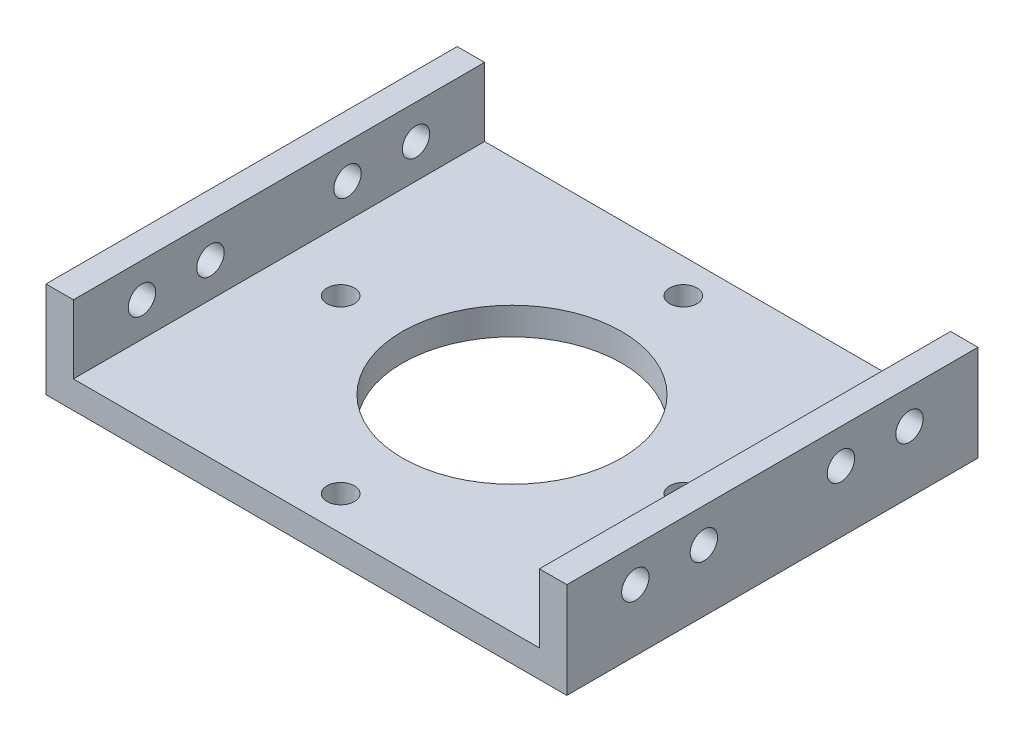
ISO-10303-21;
HEADER;
FILE_DESCRIPTION(('STEP AP214'),'2;1');
FILE_NAME('part.step','',(''),(''),'','','');
FILE_SCHEMA(('AUTOMOTIVE_DESIGN { 1 0 10303 214 1 1 1 1 }'));
ENDSEC;
DATA;
#1=APPLICATION_CONTEXT('core data for automotive mechanical design processes');
#2=APPLICATION_PROTOCOL_DEFINITION('international standard','automotive_design',2000,#1);
#3=PRODUCT_CONTEXT('',#1,'mechanical');
#4=PRODUCT('Part','Part','',(#3));
#5=PRODUCT_RELATED_PRODUCT_CATEGORY('part','',(#4));
#6=PRODUCT_DEFINITION_FORMATION('','',#4);
#7=PRODUCT_DEFINITION_CONTEXT('part definition',#1,'design');
#8=PRODUCT_DEFINITION('design','',#6,#7);
#9=PRODUCT_DEFINITION_SHAPE('','',#8);
#10=(LENGTH_UNIT() NAMED_UNIT(*) SI_UNIT(.MILLI.,.METRE.));
#11=(NAMED_UNIT(*) PLANE_ANGLE_UNIT() SI_UNIT($,.RADIAN.));
#12=(NAMED_UNIT(*) SI_UNIT($,.STERADIAN.) SOLID_ANGLE_UNIT());
#13=UNCERTAINTY_MEASURE_WITH_UNIT(LENGTH_MEASURE(1.E-05),#10,'distance_accuracy_value','');
#14=(GEOMETRIC_REPRESENTATION_CONTEXT(3) GLOBAL_UNCERTAINTY_ASSIGNED_CONTEXT((#13)) GLOBAL_UNIT_ASSIGNED_CONTEXT((#10,
#11,#12)) REPRESENTATION_CONTEXT('',''));
#15=CARTESIAN_POINT('',(0.,0.,0.));
#16=DIRECTION('',(0.,0.,1.));
#17=DIRECTION('',(1.,0.,0.));
#18=AXIS2_PLACEMENT_3D('',#15,#16,#17);
#19=CARTESIAN_POINT('',(38.,14.,30.));
#20=DIRECTION('',(0.,-1.,0.));
#21=DIRECTION('',(0.,0.,-1.));
#22=AXIS2_PLACEMENT_3D('',#19,#20,#21);
#23=PLANE('',#22);
#24=DIRECTION('',(-1.,0.,0.));
#25=VECTOR('',#24,1.);
#26=CARTESIAN_POINT('',(38.,14.,-30.));
#27=LINE('',#26,#25);
#28=CARTESIAN_POINT('',(38.,14.,-30.));
#29=VERTEX_POINT('',#28);
#30=CARTESIAN_POINT('',(34.,14.,-30.));
#31=VERTEX_POINT('',#30);
#32=EDGE_CURVE('E132',#29,#31,#27,.T.);
#33=ORIENTED_EDGE('',*,*,#32,.T.);
#34=DIRECTION('',(0.,0.,-1.));
#35=VECTOR('',#34,1.);
#36=CARTESIAN_POINT('',(34.,14.,30.));
#37=LINE('',#36,#35);
#38=CARTESIAN_POINT('',(34.,14.,30.));
#39=VERTEX_POINT('',#38);
#40=EDGE_CURVE('E11',#39,#31,#37,.T.);
#41=ORIENTED_EDGE('',*,*,#40,.F.);
#42=DIRECTION('',(-1.,0.,0.));
#43=VECTOR('',#42,1.);
#44=CARTESIAN_POINT('',(38.,14.,30.));
#45=LINE('',#44,#43);
#46=CARTESIAN_POINT('',(38.,14.,30.));
#47=VERTEX_POINT('',#46);
#48=EDGE_CURVE('E147',#47,#39,#45,.T.);
#49=ORIENTED_EDGE('',*,*,#48,.F.);
#50=DIRECTION('',(0.,0.,-1.));
#51=VECTOR('',#50,1.);
#52=CARTESIAN_POINT('',(38.,14.,30.));
#53=LINE('',#52,#51);
#54=EDGE_CURVE('E128',#47,#29,#53,.T.);
#55=ORIENTED_EDGE('',*,*,#54,.T.);
#56=EDGE_LOOP('',(#33,#41,#49,#55));
#57=FACE_BOUND('',#56,.T.);
#58=ADVANCED_FACE('F36',(#57),#23,.F.);
#59=CARTESIAN_POINT('',(34.,14.,30.));
#60=DIRECTION('',(1.,0.,0.));
#61=DIRECTION('',(0.,0.,-1.));
#62=AXIS2_PLACEMENT_3D('',#59,#60,#61);
#63=PLANE('',#62);
#64=CARTESIAN_POINT('',(34.,8.99999999999999,20.));
#65=DIRECTION('',(1.,0.,0.));
#66=DIRECTION('',(0.,0.,-1.));
#67=AXIS2_PLACEMENT_3D('',#64,#65,#66);
#68=CIRCLE('',#67,2.);
#69=CARTESIAN_POINT('',(34.,8.99999999999999,18.));
#70=VERTEX_POINT('',#69);
#71=EDGE_CURVE('E136',#70,#70,#68,.T.);
#72=ORIENTED_EDGE('',*,*,#71,.T.);
#73=EDGE_LOOP('',(#72));
#74=FACE_BOUND('',#73,.T.);
#75=CARTESIAN_POINT('',(34.,8.99999999999999,10.));
#76=DIRECTION('',(1.,0.,0.));
#77=DIRECTION('',(0.,0.,-1.));
#78=AXIS2_PLACEMENT_3D('',#75,#76,#77);
#79=CIRCLE('',#78,2.);
#80=CARTESIAN_POINT('',(34.,8.99999999999999,8.));
#81=VERTEX_POINT('',#80);
#82=EDGE_CURVE('E185',#81,#81,#79,.T.);
#83=ORIENTED_EDGE('',*,*,#82,.T.);
#84=EDGE_LOOP('',(#83));
#85=FACE_BOUND('',#84,.T.);
#86=CARTESIAN_POINT('',(34.,8.99999999999999,-10.));
#87=DIRECTION('',(1.,0.,0.));
#88=DIRECTION('',(0.,0.,-1.));
#89=AXIS2_PLACEMENT_3D('',#86,#87,#88);
#90=CIRCLE('',#89,2.);
#91=CARTESIAN_POINT('',(34.,8.99999999999999,-12.));
#92=VERTEX_POINT('',#91);
#93=EDGE_CURVE('E191',#92,#92,#90,.T.);
#94=ORIENTED_EDGE('',*,*,#93,.T.);
#95=EDGE_LOOP('',(#94));
#96=FACE_BOUND('',#95,.T.);
#97=CARTESIAN_POINT('',(34.,8.99999999999999,-20.));
#98=DIRECTION('',(1.,0.,0.));
#99=DIRECTION('',(0.,0.,-1.));
#100=AXIS2_PLACEMENT_3D('',#97,#98,#99);
#101=CIRCLE('',#100,2.);
#102=CARTESIAN_POINT('',(34.,8.99999999999999,-22.));
#103=VERTEX_POINT('',#102);
#104=EDGE_CURVE('E197',#103,#103,#101,.T.);
#105=ORIENTED_EDGE('',*,*,#104,.T.);
#106=EDGE_LOOP('',(#105));
#107=FACE_BOUND('',#106,.T.);
#108=DIRECTION('',(0.,-1.,0.));
#109=VECTOR('',#108,1.);
#110=CARTESIAN_POINT('',(34.,14.,-30.));
#111=LINE('',#110,#109);
#112=CARTESIAN_POINT('',(34.,3.99999999999999,-30.));
#113=VERTEX_POINT('',#112);
#114=EDGE_CURVE('E135',#31,#113,#111,.T.);
#115=ORIENTED_EDGE('',*,*,#114,.T.);
#116=DIRECTION('',(0.,0.,-1.));
#117=VECTOR('',#116,1.);
#118=CARTESIAN_POINT('',(34.,3.99999999999999,30.));
#119=LINE('',#118,#117);
#120=CARTESIAN_POINT('',(34.,3.99999999999999,30.));
#121=VERTEX_POINT('',#120);
#122=EDGE_CURVE('E44',#121,#113,#119,.T.);
#123=ORIENTED_EDGE('',*,*,#122,.F.);
#124=DIRECTION('',(0.,-1.,0.));
#125=VECTOR('',#124,1.);
#126=CARTESIAN_POINT('',(34.,14.,30.));
#127=LINE('',#126,#125);
#128=EDGE_CURVE('E95',#39,#121,#127,.T.);
#129=ORIENTED_EDGE('',*,*,#128,.F.);
#130=ORIENTED_EDGE('',*,*,#40,.T.);
#131=EDGE_LOOP('',(#115,#123,#129,#130));
#132=FACE_BOUND('',#131,.T.);
#133=ADVANCED_FACE('F262',(#74,#85,#96,#107,#132),#63,.F.);
#134=CARTESIAN_POINT('',(-34.,3.99999999999999,30.));
#135=DIRECTION('',(0.,-1.,0.));
#136=DIRECTION('',(0.,0.,-1.));
#137=AXIS2_PLACEMENT_3D('',#134,#135,#136);
#138=PLANE('',#137);
#139=CARTESIAN_POINT('',(0.,3.99999999999999,-25.));
#140=DIRECTION('',(0.,1.,0.));
#141=DIRECTION('',(0.,0.,1.));
#142=AXIS2_PLACEMENT_3D('',#139,#140,#141);
#143=CIRCLE('',#142,2.);
#144=CARTESIAN_POINT('',(0.,3.99999999999999,-23.));
#145=VERTEX_POINT('',#144);
#146=EDGE_CURVE('E237',#145,#145,#143,.T.);
#147=ORIENTED_EDGE('',*,*,#146,.F.);
#148=EDGE_LOOP('',(#147));
#149=FACE_BOUND('',#148,.T.);
#150=CARTESIAN_POINT('',(25.0000000000007,3.99999999999999,-7.05950310263298E-13));
#151=DIRECTION('',(0.,1.,0.));
#152=DIRECTION('',(0.,0.,1.));
#153=AXIS2_PLACEMENT_3D('',#150,#151,#152);
#154=CIRCLE('',#153,2.00000000000055);
#155=CARTESIAN_POINT('',(25.0000000000007,3.99999999999999,1.99999999999985));
#156=VERTEX_POINT('',#155);
#157=EDGE_CURVE('E238',#156,#156,#154,.T.);
#158=ORIENTED_EDGE('',*,*,#157,.F.);
#159=EDGE_LOOP('',(#158));
#160=FACE_BOUND('',#159,.T.);
#161=CARTESIAN_POINT('',(1.4119006205266E-12,3.99999999999999,25.));
#162=DIRECTION('',(0.,1.,0.));
#163=DIRECTION('',(0.,0.,1.));
#164=AXIS2_PLACEMENT_3D('',#161,#162,#163);
#165=CIRCLE('',#164,2.00000000000152);
#166=CARTESIAN_POINT('',(1.4119006205266E-12,3.99999999999999,27.0000000000015));
#167=VERTEX_POINT('',#166);
#168=EDGE_CURVE('E249',#167,#167,#165,.T.);
#169=ORIENTED_EDGE('',*,*,#168,.F.);
#170=EDGE_LOOP('',(#169));
#171=FACE_BOUND('',#170,.T.);
#172=CARTESIAN_POINT('',(-24.9999999999993,3.99999999999999,7.09011927261166E-13));
#173=DIRECTION('',(0.,1.,0.));
#174=DIRECTION('',(0.,0.,1.));
#175=AXIS2_PLACEMENT_3D('',#172,#173,#174);
#176=CIRCLE('',#175,2.00000000000113);
#177=CARTESIAN_POINT('',(-24.9999999999993,3.99999999999999,2.00000000000184));
#178=VERTEX_POINT('',#177);
#179=EDGE_CURVE('E250',#178,#178,#176,.T.);
#180=ORIENTED_EDGE('',*,*,#179,.F.);
#181=EDGE_LOOP('',(#180));
#182=FACE_BOUND('',#181,.T.);
#183=CARTESIAN_POINT('',(0.,3.99999999999999,0.));
#184=DIRECTION('',(0.,1.,0.));
#185=DIRECTION('',(0.,0.,1.));
#186=AXIS2_PLACEMENT_3D('',#183,#184,#185);
#187=CIRCLE('',#186,16.);
#188=CARTESIAN_POINT('',(0.,3.99999999999999,16.));
#189=VERTEX_POINT('',#188);
#190=EDGE_CURVE('E230',#189,#189,#187,.T.);
#191=ORIENTED_EDGE('',*,*,#190,.F.);
#192=EDGE_LOOP('',(#191));
#193=FACE_BOUND('',#192,.T.);
#194=DIRECTION('',(-1.,0.,0.));
#195=VECTOR('',#194,1.);
#196=CARTESIAN_POINT('',(-34.,3.99999999999999,-30.));
#197=LINE('',#196,#195);
#198=CARTESIAN_POINT('',(-34.,3.99999999999999,-30.));
#199=VERTEX_POINT('',#198);
#200=EDGE_CURVE('E138',#113,#199,#197,.T.);
#201=ORIENTED_EDGE('',*,*,#200,.T.);
#202=DIRECTION('',(0.,0.,-1.));
#203=VECTOR('',#202,1.);
#204=CARTESIAN_POINT('',(-34.,3.99999999999999,30.));
#205=LINE('',#204,#203);
#206=CARTESIAN_POINT('',(-34.,3.99999999999999,30.));
#207=VERTEX_POINT('',#206);
#208=EDGE_CURVE('E154',#207,#199,#205,.T.);
#209=ORIENTED_EDGE('',*,*,#208,.F.);
#210=DIRECTION('',(-1.,0.,0.));
#211=VECTOR('',#210,1.);
#212=CARTESIAN_POINT('',(-34.,3.99999999999999,30.));
#213=LINE('',#212,#211);
#214=EDGE_CURVE('E162',#121,#207,#213,.T.);
#215=ORIENTED_EDGE('',*,*,#214,.F.);
#216=ORIENTED_EDGE('',*,*,#122,.T.);
#217=EDGE_LOOP('',(#201,#209,#215,#216));
#218=FACE_BOUND('',#217,.T.);
#219=ADVANCED_FACE('F160',(#149,#160,#171,#182,#193,#218),#138,.F.);
#220=CARTESIAN_POINT('',(-34.,14.,30.));
#221=DIRECTION('',(-1.,0.,0.));
#222=DIRECTION('',(0.,0.,1.));
#223=AXIS2_PLACEMENT_3D('',#220,#221,#222);
#224=PLANE('',#223);
#225=CARTESIAN_POINT('',(-34.,8.99999999999999,20.));
#226=DIRECTION('',(-1.,0.,0.));
#227=DIRECTION('',(0.,0.,1.));
#228=AXIS2_PLACEMENT_3D('',#225,#226,#227);
#229=CIRCLE('',#228,2.);
#230=CARTESIAN_POINT('',(-34.,8.99999999999999,22.));
#231=VERTEX_POINT('',#230);
#232=EDGE_CURVE('E182',#231,#231,#229,.T.);
#233=ORIENTED_EDGE('',*,*,#232,.T.);
#234=EDGE_LOOP('',(#233));
#235=FACE_BOUND('',#234,.T.);
#236=CARTESIAN_POINT('',(-34.,8.99999999999999,10.));
#237=DIRECTION('',(-1.,0.,0.));
#238=DIRECTION('',(0.,0.,1.));
#239=AXIS2_PLACEMENT_3D('',#236,#237,#238);
#240=CIRCLE('',#239,2.);
#241=CARTESIAN_POINT('',(-34.,8.99999999999999,12.));
#242=VERTEX_POINT('',#241);
#243=EDGE_CURVE('E188',#242,#242,#240,.T.);
#244=ORIENTED_EDGE('',*,*,#243,.T.);
#245=EDGE_LOOP('',(#244));
#246=FACE_BOUND('',#245,.T.);
#247=CARTESIAN_POINT('',(-34.,8.99999999999999,-10.));
#248=DIRECTION('',(-1.,0.,0.));
#249=DIRECTION('',(0.,0.,1.));
#250=AXIS2_PLACEMENT_3D('',#247,#248,#249);
#251=CIRCLE('',#250,2.);
#252=CARTESIAN_POINT('',(-34.,8.99999999999999,-8.));
#253=VERTEX_POINT('',#252);
#254=EDGE_CURVE('E194',#253,#253,#251,.T.);
#255=ORIENTED_EDGE('',*,*,#254,.T.);
#256=EDGE_LOOP('',(#255));
#257=FACE_BOUND('',#256,.T.);
#258=CARTESIAN_POINT('',(-34.,8.99999999999999,-20.));
#259=DIRECTION('',(-1.,0.,0.));
#260=DIRECTION('',(0.,0.,1.));
#261=AXIS2_PLACEMENT_3D('',#258,#259,#260);
#262=CIRCLE('',#261,2.);
#263=CARTESIAN_POINT('',(-34.,8.99999999999999,-18.));
#264=VERTEX_POINT('',#263);
#265=EDGE_CURVE('E200',#264,#264,#262,.T.);
#266=ORIENTED_EDGE('',*,*,#265,.T.);
#267=EDGE_LOOP('',(#266));
#268=FACE_BOUND('',#267,.T.);
#269=DIRECTION('',(0.,1.,0.));
#270=VECTOR('',#269,1.);
#271=CARTESIAN_POINT('',(-34.,14.,-30.));
#272=LINE('',#271,#270);
#273=CARTESIAN_POINT('',(-34.,14.,-30.));
#274=VERTEX_POINT('',#273);
#275=EDGE_CURVE('E140',#199,#274,#272,.T.);
#276=ORIENTED_EDGE('',*,*,#275,.T.);
#277=DIRECTION('',(0.,0.,-1.));
#278=VECTOR('',#277,1.);
#279=CARTESIAN_POINT('',(-34.,14.,30.));
#280=LINE('',#279,#278);
#281=CARTESIAN_POINT('',(-34.,14.,30.));
#282=VERTEX_POINT('',#281);
#283=EDGE_CURVE('E151',#282,#274,#280,.T.);
#284=ORIENTED_EDGE('',*,*,#283,.F.);
#285=DIRECTION('',(0.,1.,0.));
#286=VECTOR('',#285,1.);
#287=CARTESIAN_POINT('',(-34.,14.,30.));
#288=LINE('',#287,#286);
#289=EDGE_CURVE('E174',#207,#282,#288,.T.);
#290=ORIENTED_EDGE('',*,*,#289,.F.);
#291=ORIENTED_EDGE('',*,*,#208,.T.);
#292=EDGE_LOOP('',(#276,#284,#290,#291));
#293=FACE_BOUND('',#292,.T.);
#294=ADVANCED_FACE('F170',(#235,#246,#257,#268,#293),#224,.F.);
#295=CARTESIAN_POINT('',(-38.,14.,30.));
#296=DIRECTION('',(0.,-1.,0.));
#297=DIRECTION('',(0.,0.,-1.));
#298=AXIS2_PLACEMENT_3D('',#295,#296,#297);
#299=PLANE('',#298);
#300=DIRECTION('',(-1.,0.,0.));
#301=VECTOR('',#300,1.);
#302=CARTESIAN_POINT('',(-38.,14.,-30.));
#303=LINE('',#302,#301);
#304=CARTESIAN_POINT('',(-38.,14.,-30.));
#305=VERTEX_POINT('',#304);
#306=EDGE_CURVE('E142',#274,#305,#303,.T.);
#307=ORIENTED_EDGE('',*,*,#306,.T.);
#308=DIRECTION('',(0.,0.,-1.));
#309=VECTOR('',#308,1.);
#310=CARTESIAN_POINT('',(-38.,14.,30.));
#311=LINE('',#310,#309);
#312=CARTESIAN_POINT('',(-38.,14.,30.));
#313=VERTEX_POINT('',#312);
#314=EDGE_CURVE('E123',#313,#305,#311,.T.);
#315=ORIENTED_EDGE('',*,*,#314,.F.);
#316=DIRECTION('',(-1.,0.,0.));
#317=VECTOR('',#316,1.);
#318=CARTESIAN_POINT('',(-38.,14.,30.));
#319=LINE('',#318,#317);
#320=EDGE_CURVE('E114',#282,#313,#319,.T.);
#321=ORIENTED_EDGE('',*,*,#320,.F.);
#322=ORIENTED_EDGE('',*,*,#283,.T.);
#323=EDGE_LOOP('',(#307,#315,#321,#322));
#324=FACE_BOUND('',#323,.T.);
#325=ADVANCED_FACE('F173',(#324),#299,.F.);
#326=CARTESIAN_POINT('',(-38.,0.,30.));
#327=DIRECTION('',(1.,0.,0.));
#328=DIRECTION('',(0.,0.,-1.));
#329=AXIS2_PLACEMENT_3D('',#326,#327,#328);
#330=PLANE('',#329);
#331=CARTESIAN_POINT('',(-38.,8.99999999999999,20.));
#332=DIRECTION('',(1.,0.,0.));
#333=DIRECTION('',(0.,0.,-1.));
#334=AXIS2_PLACEMENT_3D('',#331,#332,#333);
#335=CIRCLE('',#334,2.);
#336=CARTESIAN_POINT('',(-38.,8.99999999999999,18.));
#337=VERTEX_POINT('',#336);
#338=EDGE_CURVE('E203',#337,#337,#335,.F.);
#339=ORIENTED_EDGE('',*,*,#338,.F.);
#340=EDGE_LOOP('',(#339));
#341=FACE_BOUND('',#340,.T.);
#342=CARTESIAN_POINT('',(-38.,8.99999999999999,10.));
#343=DIRECTION('',(1.,0.,0.));
#344=DIRECTION('',(0.,0.,-1.));
#345=AXIS2_PLACEMENT_3D('',#342,#343,#344);
#346=CIRCLE('',#345,2.);
#347=CARTESIAN_POINT('',(-38.,8.99999999999999,8.));
#348=VERTEX_POINT('',#347);
#349=EDGE_CURVE('E218',#348,#348,#346,.F.);
#350=ORIENTED_EDGE('',*,*,#349,.F.);
#351=EDGE_LOOP('',(#350));
#352=FACE_BOUND('',#351,.T.);
#353=CARTESIAN_POINT('',(-38.,8.99999999999999,-10.));
#354=DIRECTION('',(1.,0.,0.));
#355=DIRECTION('',(0.,0.,-1.));
#356=AXIS2_PLACEMENT_3D('',#353,#354,#355);
#357=CIRCLE('',#356,2.);
#358=CARTESIAN_POINT('',(-38.,8.99999999999999,-12.));
#359=VERTEX_POINT('',#358);
#360=EDGE_CURVE('E212',#359,#359,#357,.F.);
#361=ORIENTED_EDGE('',*,*,#360,.F.);
#362=EDGE_LOOP('',(#361));
#363=FACE_BOUND('',#362,.T.);
#364=CARTESIAN_POINT('',(-38.,8.99999999999999,-20.));
#365=DIRECTION('',(1.,0.,0.));
#366=DIRECTION('',(0.,0.,-1.));
#367=AXIS2_PLACEMENT_3D('',#364,#365,#366);
#368=CIRCLE('',#367,2.);
#369=CARTESIAN_POINT('',(-38.,8.99999999999999,-22.));
#370=VERTEX_POINT('',#369);
#371=EDGE_CURVE('E204',#370,#370,#368,.F.);
#372=ORIENTED_EDGE('',*,*,#371,.F.);
#373=EDGE_LOOP('',(#372));
#374=FACE_BOUND('',#373,.T.);
#375=DIRECTION('',(0.,-1.,0.));
#376=VECTOR('',#375,1.);
#377=CARTESIAN_POINT('',(-38.,0.,-30.));
#378=LINE('',#377,#376);
#379=CARTESIAN_POINT('',(-38.,0.,-30.));
#380=VERTEX_POINT('',#379);
#381=EDGE_CURVE('E122',#305,#380,#378,.T.);
#382=ORIENTED_EDGE('',*,*,#381,.T.);
#383=DIRECTION('',(0.,0.,-1.));
#384=VECTOR('',#383,1.);
#385=CARTESIAN_POINT('',(-38.,0.,30.));
#386=LINE('',#385,#384);
#387=CARTESIAN_POINT('',(-38.,0.,30.));
#388=VERTEX_POINT('',#387);
#389=EDGE_CURVE('E119',#388,#380,#386,.T.);
#390=ORIENTED_EDGE('',*,*,#389,.F.);
#391=DIRECTION('',(0.,-1.,0.));
#392=VECTOR('',#391,1.);
#393=CARTESIAN_POINT('',(-38.,0.,30.));
#394=LINE('',#393,#392);
#395=EDGE_CURVE('E108',#313,#388,#394,.T.);
#396=ORIENTED_EDGE('',*,*,#395,.F.);
#397=ORIENTED_EDGE('',*,*,#314,.T.);
#398=EDGE_LOOP('',(#382,#390,#396,#397));
#399=FACE_BOUND('',#398,.T.);
#400=ADVANCED_FACE('F120',(#341,#352,#363,#374,#399),#330,.F.);
#401=CARTESIAN_POINT('',(38.,0.,30.));
#402=DIRECTION('',(0.,1.,0.));
#403=DIRECTION('',(0.,0.,1.));
#404=AXIS2_PLACEMENT_3D('',#401,#402,#403);
#405=PLANE('',#404);
#406=CARTESIAN_POINT('',(0.,0.,-25.));
#407=DIRECTION('',(0.,1.,0.));
#408=DIRECTION('',(0.,0.,1.));
#409=AXIS2_PLACEMENT_3D('',#406,#407,#408);
#410=CIRCLE('',#409,2.);
#411=CARTESIAN_POINT('',(0.,0.,-23.));
#412=VERTEX_POINT('',#411);
#413=EDGE_CURVE('E233',#412,#412,#410,.F.);
#414=ORIENTED_EDGE('',*,*,#413,.F.);
#415=EDGE_LOOP('',(#414));
#416=FACE_BOUND('',#415,.T.);
#417=CARTESIAN_POINT('',(25.0000000000007,0.,-7.05950310263298E-13));
#418=DIRECTION('',(0.,1.,0.));
#419=DIRECTION('',(0.,0.,1.));
#420=AXIS2_PLACEMENT_3D('',#417,#418,#419);
#421=CIRCLE('',#420,2.00000000000055);
#422=CARTESIAN_POINT('',(25.0000000000007,0.,1.99999999999985));
#423=VERTEX_POINT('',#422);
#424=EDGE_CURVE('E234',#423,#423,#421,.F.);
#425=ORIENTED_EDGE('',*,*,#424,.F.);
#426=EDGE_LOOP('',(#425));
#427=FACE_BOUND('',#426,.T.);
#428=CARTESIAN_POINT('',(1.4119006205266E-12,0.,25.));
#429=DIRECTION('',(0.,1.,0.));
#430=DIRECTION('',(0.,0.,1.));
#431=AXIS2_PLACEMENT_3D('',#428,#429,#430);
#432=CIRCLE('',#431,2.00000000000152);
#433=CARTESIAN_POINT('',(1.4119006205266E-12,0.,27.0000000000015));
#434=VERTEX_POINT('',#433);
#435=EDGE_CURVE('E241',#434,#434,#432,.F.);
#436=ORIENTED_EDGE('',*,*,#435,.F.);
#437=EDGE_LOOP('',(#436));
#438=FACE_BOUND('',#437,.T.);
#439=CARTESIAN_POINT('',(-24.9999999999993,0.,7.09011927261166E-13));
#440=DIRECTION('',(0.,1.,0.));
#441=DIRECTION('',(0.,0.,1.));
#442=AXIS2_PLACEMENT_3D('',#439,#440,#441);
#443=CIRCLE('',#442,2.00000000000113);
#444=CARTESIAN_POINT('',(-24.9999999999993,0.,2.00000000000184));
#445=VERTEX_POINT('',#444);
#446=EDGE_CURVE('E246',#445,#445,#443,.F.);
#447=ORIENTED_EDGE('',*,*,#446,.F.);
#448=EDGE_LOOP('',(#447));
#449=FACE_BOUND('',#448,.T.);
#450=CARTESIAN_POINT('',(0.,0.,0.));
#451=DIRECTION('',(0.,1.,0.));
#452=DIRECTION('',(0.,0.,1.));
#453=AXIS2_PLACEMENT_3D('',#450,#451,#452);
#454=CIRCLE('',#453,16.);
#455=CARTESIAN_POINT('',(0.,0.,16.));
#456=VERTEX_POINT('',#455);
#457=EDGE_CURVE('E211',#456,#456,#454,.F.);
#458=ORIENTED_EDGE('',*,*,#457,.F.);
#459=EDGE_LOOP('',(#458));
#460=FACE_BOUND('',#459,.T.);
#461=DIRECTION('',(1.,0.,0.));
#462=VECTOR('',#461,1.);
#463=CARTESIAN_POINT('',(38.,0.,-30.));
#464=LINE('',#463,#462);
#465=CARTESIAN_POINT('',(38.,0.,-30.));
#466=VERTEX_POINT('',#465);
#467=EDGE_CURVE('E81',#380,#466,#464,.T.);
#468=ORIENTED_EDGE('',*,*,#467,.T.);
#469=DIRECTION('',(0.,0.,-1.));
#470=VECTOR('',#469,1.);
#471=CARTESIAN_POINT('',(38.,0.,30.));
#472=LINE('',#471,#470);
#473=CARTESIAN_POINT('',(38.,0.,30.));
#474=VERTEX_POINT('',#473);
#475=EDGE_CURVE('E124',#474,#466,#472,.T.);
#476=ORIENTED_EDGE('',*,*,#475,.F.);
#477=DIRECTION('',(1.,0.,0.));
#478=VECTOR('',#477,1.);
#479=CARTESIAN_POINT('',(38.,0.,30.));
#480=LINE('',#479,#478);
#481=EDGE_CURVE('E112',#388,#474,#480,.T.);
#482=ORIENTED_EDGE('',*,*,#481,.F.);
#483=ORIENTED_EDGE('',*,*,#389,.T.);
#484=EDGE_LOOP('',(#468,#476,#482,#483));
#485=FACE_BOUND('',#484,.T.);
#486=ADVANCED_FACE('F126',(#416,#427,#438,#449,#460,#485),#405,.F.);
#487=CARTESIAN_POINT('',(38.,0.,30.));
#488=DIRECTION('',(-1.,0.,0.));
#489=DIRECTION('',(0.,0.,1.));
#490=AXIS2_PLACEMENT_3D('',#487,#488,#489);
#491=PLANE('',#490);
#492=CARTESIAN_POINT('',(38.,8.99999999999999,20.));
#493=DIRECTION('',(1.,0.,0.));
#494=DIRECTION('',(0.,0.,-1.));
#495=AXIS2_PLACEMENT_3D('',#492,#493,#494);
#496=CIRCLE('',#495,2.);
#497=CARTESIAN_POINT('',(38.,8.99999999999999,18.));
#498=VERTEX_POINT('',#497);
#499=EDGE_CURVE('E221',#498,#498,#496,.T.);
#500=ORIENTED_EDGE('',*,*,#499,.F.);
#501=EDGE_LOOP('',(#500));
#502=FACE_BOUND('',#501,.T.);
#503=CARTESIAN_POINT('',(38.,8.99999999999999,10.));
#504=DIRECTION('',(1.,0.,0.));
#505=DIRECTION('',(0.,0.,-1.));
#506=AXIS2_PLACEMENT_3D('',#503,#504,#505);
#507=CIRCLE('',#506,2.);
#508=CARTESIAN_POINT('',(38.,8.99999999999999,8.));
#509=VERTEX_POINT('',#508);
#510=EDGE_CURVE('E215',#509,#509,#507,.T.);
#511=ORIENTED_EDGE('',*,*,#510,.F.);
#512=EDGE_LOOP('',(#511));
#513=FACE_BOUND('',#512,.T.);
#514=CARTESIAN_POINT('',(38.,8.99999999999999,-10.));
#515=DIRECTION('',(1.,0.,0.));
#516=DIRECTION('',(0.,0.,1.));
#517=AXIS2_PLACEMENT_3D('',#514,#515,#516);
#518=CIRCLE('',#517,2.);
#519=CARTESIAN_POINT('',(38.,8.99999999999999,-8.));
#520=VERTEX_POINT('',#519);
#521=EDGE_CURVE('E207',#520,#520,#518,.T.);
#522=ORIENTED_EDGE('',*,*,#521,.F.);
#523=EDGE_LOOP('',(#522));
#524=FACE_BOUND('',#523,.T.);
#525=CARTESIAN_POINT('',(38.,8.99999999999999,-20.));
#526=DIRECTION('',(1.,0.,0.));
#527=DIRECTION('',(0.,0.,1.));
#528=AXIS2_PLACEMENT_3D('',#525,#526,#527);
#529=CIRCLE('',#528,2.);
#530=CARTESIAN_POINT('',(38.,8.99999999999999,-18.));
#531=VERTEX_POINT('',#530);
#532=EDGE_CURVE('E208',#531,#531,#529,.T.);
#533=ORIENTED_EDGE('',*,*,#532,.F.);
#534=EDGE_LOOP('',(#533));
#535=FACE_BOUND('',#534,.T.);
#536=DIRECTION('',(0.,1.,0.));
#537=VECTOR('',#536,1.);
#538=CARTESIAN_POINT('',(38.,0.,-30.));
#539=LINE('',#538,#537);
#540=EDGE_CURVE('E87',#466,#29,#539,.T.);
#541=ORIENTED_EDGE('',*,*,#540,.T.);
#542=ORIENTED_EDGE('',*,*,#54,.F.);
#543=DIRECTION('',(0.,1.,0.));
#544=VECTOR('',#543,1.);
#545=CARTESIAN_POINT('',(38.,0.,30.));
#546=LINE('',#545,#544);
#547=EDGE_CURVE('E52',#474,#47,#546,.T.);
#548=ORIENTED_EDGE('',*,*,#547,.F.);
#549=ORIENTED_EDGE('',*,*,#475,.T.);
#550=EDGE_LOOP('',(#541,#542,#548,#549));
#551=FACE_BOUND('',#550,.T.);
#552=ADVANCED_FACE('F294',(#502,#513,#524,#535,#551),#491,.F.);
#553=CARTESIAN_POINT('',(0.,0.,30.));
#554=DIRECTION('',(0.,0.,1.));
#555=DIRECTION('',(1.,0.,0.));
#556=AXIS2_PLACEMENT_3D('',#553,#554,#555);
#557=PLANE('',#556);
#558=ORIENTED_EDGE('',*,*,#48,.T.);
#559=ORIENTED_EDGE('',*,*,#128,.T.);
#560=ORIENTED_EDGE('',*,*,#214,.T.);
#561=ORIENTED_EDGE('',*,*,#289,.T.);
#562=ORIENTED_EDGE('',*,*,#320,.T.);
#563=ORIENTED_EDGE('',*,*,#395,.T.);
#564=ORIENTED_EDGE('',*,*,#481,.T.);
#565=ORIENTED_EDGE('',*,*,#547,.T.);
#566=EDGE_LOOP('',(#558,#559,#560,#561,#562,#563,#564,#565));
#567=FACE_BOUND('',#566,.T.);
#568=ADVANCED_FACE('F110',(#567),#557,.T.);
#569=CARTESIAN_POINT('',(0.,0.,-30.));
#570=DIRECTION('',(0.,0.,1.));
#571=DIRECTION('',(1.,0.,0.));
#572=AXIS2_PLACEMENT_3D('',#569,#570,#571);
#573=PLANE('',#572);
#574=ORIENTED_EDGE('',*,*,#32,.F.);
#575=ORIENTED_EDGE('',*,*,#540,.F.);
#576=ORIENTED_EDGE('',*,*,#467,.F.);
#577=ORIENTED_EDGE('',*,*,#381,.F.);
#578=ORIENTED_EDGE('',*,*,#306,.F.);
#579=ORIENTED_EDGE('',*,*,#275,.F.);
#580=ORIENTED_EDGE('',*,*,#200,.F.);
#581=ORIENTED_EDGE('',*,*,#114,.F.);
#582=EDGE_LOOP('',(#574,#575,#576,#577,#578,#579,#580,#581));
#583=FACE_BOUND('',#582,.T.);
#584=ADVANCED_FACE('F166',(#583),#573,.F.);
#585=CARTESIAN_POINT('',(-43.6568542494924,8.99999999999999,-20.));
#586=DIRECTION('',(1.,0.,0.));
#587=DIRECTION('',(0.,0.,-1.));
#588=AXIS2_PLACEMENT_3D('',#585,#586,#587);
#589=CYLINDRICAL_SURFACE('',#588,2.);
#590=ORIENTED_EDGE('',*,*,#532,.T.);
#591=EDGE_LOOP('',(#590));
#592=FACE_BOUND('',#591,.T.);
#593=ORIENTED_EDGE('',*,*,#104,.F.);
#594=EDGE_LOOP('',(#593));
#595=FACE_BOUND('',#594,.T.);
#596=ADVANCED_FACE('F331',(#592,#595),#589,.F.);
#597=CARTESIAN_POINT('',(-43.6568542494924,8.99999999999999,-10.));
#598=DIRECTION('',(1.,0.,0.));
#599=DIRECTION('',(0.,0.,-1.));
#600=AXIS2_PLACEMENT_3D('',#597,#598,#599);
#601=CYLINDRICAL_SURFACE('',#600,2.);
#602=ORIENTED_EDGE('',*,*,#521,.T.);
#603=EDGE_LOOP('',(#602));
#604=FACE_BOUND('',#603,.T.);
#605=ORIENTED_EDGE('',*,*,#93,.F.);
#606=EDGE_LOOP('',(#605));
#607=FACE_BOUND('',#606,.T.);
#608=ADVANCED_FACE('F338',(#604,#607),#601,.F.);
#609=CARTESIAN_POINT('',(-43.6568542494924,8.99999999999999,10.));
#610=DIRECTION('',(1.,0.,0.));
#611=DIRECTION('',(0.,0.,-1.));
#612=AXIS2_PLACEMENT_3D('',#609,#610,#611);
#613=CYLINDRICAL_SURFACE('',#612,2.);
#614=ORIENTED_EDGE('',*,*,#510,.T.);
#615=EDGE_LOOP('',(#614));
#616=FACE_BOUND('',#615,.T.);
#617=ORIENTED_EDGE('',*,*,#82,.F.);
#618=EDGE_LOOP('',(#617));
#619=FACE_BOUND('',#618,.T.);
#620=ADVANCED_FACE('F339',(#616,#619),#613,.F.);
#621=CARTESIAN_POINT('',(-43.6568542494924,8.99999999999999,20.));
#622=DIRECTION('',(1.,0.,0.));
#623=DIRECTION('',(0.,0.,-1.));
#624=AXIS2_PLACEMENT_3D('',#621,#622,#623);
#625=CYLINDRICAL_SURFACE('',#624,2.);
#626=ORIENTED_EDGE('',*,*,#499,.T.);
#627=EDGE_LOOP('',(#626));
#628=FACE_BOUND('',#627,.T.);
#629=ORIENTED_EDGE('',*,*,#71,.F.);
#630=EDGE_LOOP('',(#629));
#631=FACE_BOUND('',#630,.T.);
#632=ADVANCED_FACE('F284',(#628,#631),#625,.F.);
#633=ORIENTED_EDGE('',*,*,#371,.T.);
#634=EDGE_LOOP('',(#633));
#635=FACE_BOUND('',#634,.T.);
#636=ORIENTED_EDGE('',*,*,#265,.F.);
#637=EDGE_LOOP('',(#636));
#638=FACE_BOUND('',#637,.T.);
#639=ADVANCED_FACE('F326',(#635,#638),#589,.F.);
#640=ORIENTED_EDGE('',*,*,#360,.T.);
#641=EDGE_LOOP('',(#640));
#642=FACE_BOUND('',#641,.T.);
#643=ORIENTED_EDGE('',*,*,#254,.F.);
#644=EDGE_LOOP('',(#643));
#645=FACE_BOUND('',#644,.T.);
#646=ADVANCED_FACE('F328',(#642,#645),#601,.F.);
#647=ORIENTED_EDGE('',*,*,#349,.T.);
#648=EDGE_LOOP('',(#647));
#649=FACE_BOUND('',#648,.T.);
#650=ORIENTED_EDGE('',*,*,#243,.F.);
#651=EDGE_LOOP('',(#650));
#652=FACE_BOUND('',#651,.T.);
#653=ADVANCED_FACE('F281',(#649,#652),#613,.F.);
#654=ORIENTED_EDGE('',*,*,#338,.T.);
#655=EDGE_LOOP('',(#654));
#656=FACE_BOUND('',#655,.T.);
#657=ORIENTED_EDGE('',*,*,#232,.F.);
#658=EDGE_LOOP('',(#657));
#659=FACE_BOUND('',#658,.T.);
#660=ADVANCED_FACE('F272',(#656,#659),#625,.F.);
#661=CARTESIAN_POINT('',(0.,-45.254833995939,0.));
#662=DIRECTION('',(0.,1.,0.));
#663=DIRECTION('',(0.,0.,1.));
#664=AXIS2_PLACEMENT_3D('',#661,#662,#663);
#665=CYLINDRICAL_SURFACE('',#664,16.);
#666=ORIENTED_EDGE('',*,*,#457,.T.);
#667=EDGE_LOOP('',(#666));
#668=FACE_BOUND('',#667,.T.);
#669=ORIENTED_EDGE('',*,*,#190,.T.);
#670=EDGE_LOOP('',(#669));
#671=FACE_BOUND('',#670,.T.);
#672=ADVANCED_FACE('F269',(#668,#671),#665,.F.);
#673=CARTESIAN_POINT('',(-24.9999999999993,-45.254833995939,7.09011927261166E-13));
#674=DIRECTION('',(0.,1.,0.));
#675=DIRECTION('',(0.,0.,1.));
#676=AXIS2_PLACEMENT_3D('',#673,#674,#675);
#677=CYLINDRICAL_SURFACE('',#676,2.00000000000113);
#678=ORIENTED_EDGE('',*,*,#446,.T.);
#679=EDGE_LOOP('',(#678));
#680=FACE_BOUND('',#679,.T.);
#681=ORIENTED_EDGE('',*,*,#179,.T.);
#682=EDGE_LOOP('',(#681));
#683=FACE_BOUND('',#682,.T.);
#684=ADVANCED_FACE('F271',(#680,#683),#677,.F.);
#685=CARTESIAN_POINT('',(1.4119006205266E-12,-45.254833995939,25.));
#686=DIRECTION('',(0.,1.,0.));
#687=DIRECTION('',(0.,0.,1.));
#688=AXIS2_PLACEMENT_3D('',#685,#686,#687);
#689=CYLINDRICAL_SURFACE('',#688,2.00000000000152);
#690=ORIENTED_EDGE('',*,*,#435,.T.);
#691=EDGE_LOOP('',(#690));
#692=FACE_BOUND('',#691,.T.);
#693=ORIENTED_EDGE('',*,*,#168,.T.);
#694=EDGE_LOOP('',(#693));
#695=FACE_BOUND('',#694,.T.);
#696=ADVANCED_FACE('F258',(#692,#695),#689,.F.);
#697=CARTESIAN_POINT('',(25.0000000000007,-45.254833995939,-7.05950310263298E-13));
#698=DIRECTION('',(0.,1.,0.));
#699=DIRECTION('',(0.,0.,1.));
#700=AXIS2_PLACEMENT_3D('',#697,#698,#699);
#701=CYLINDRICAL_SURFACE('',#700,2.00000000000055);
#702=ORIENTED_EDGE('',*,*,#424,.T.);
#703=EDGE_LOOP('',(#702));
#704=FACE_BOUND('',#703,.T.);
#705=ORIENTED_EDGE('',*,*,#157,.T.);
#706=EDGE_LOOP('',(#705));
#707=FACE_BOUND('',#706,.T.);
#708=ADVANCED_FACE('F463',(#704,#707),#701,.F.);
#709=CARTESIAN_POINT('',(0.,-45.254833995939,-25.));
#710=DIRECTION('',(0.,1.,0.));
#711=DIRECTION('',(0.,0.,1.));
#712=AXIS2_PLACEMENT_3D('',#709,#710,#711);
#713=CYLINDRICAL_SURFACE('',#712,2.);
#714=ORIENTED_EDGE('',*,*,#413,.T.);
#715=EDGE_LOOP('',(#714));
#716=FACE_BOUND('',#715,.T.);
#717=ORIENTED_EDGE('',*,*,#146,.T.);
#718=EDGE_LOOP('',(#717));
#719=FACE_BOUND('',#718,.T.);
#720=ADVANCED_FACE('F472',(#716,#719),#713,.F.);
#721=CLOSED_SHELL('',(#58,#133,#219,#294,#325,#400,#486,#552,#568,#584,#596,#608,#620,#632,#639,
#646,#653,#660,#672,#684,#696,#708,#720));
#722=MANIFOLD_SOLID_BREP('B2',#721);
#723=ADVANCED_BREP_SHAPE_REPRESENTATION('',(#18,#722),#14);
#724=SHAPE_DEFINITION_REPRESENTATION(#9,#723);
ENDSEC;
END-ISO-10303-21;
